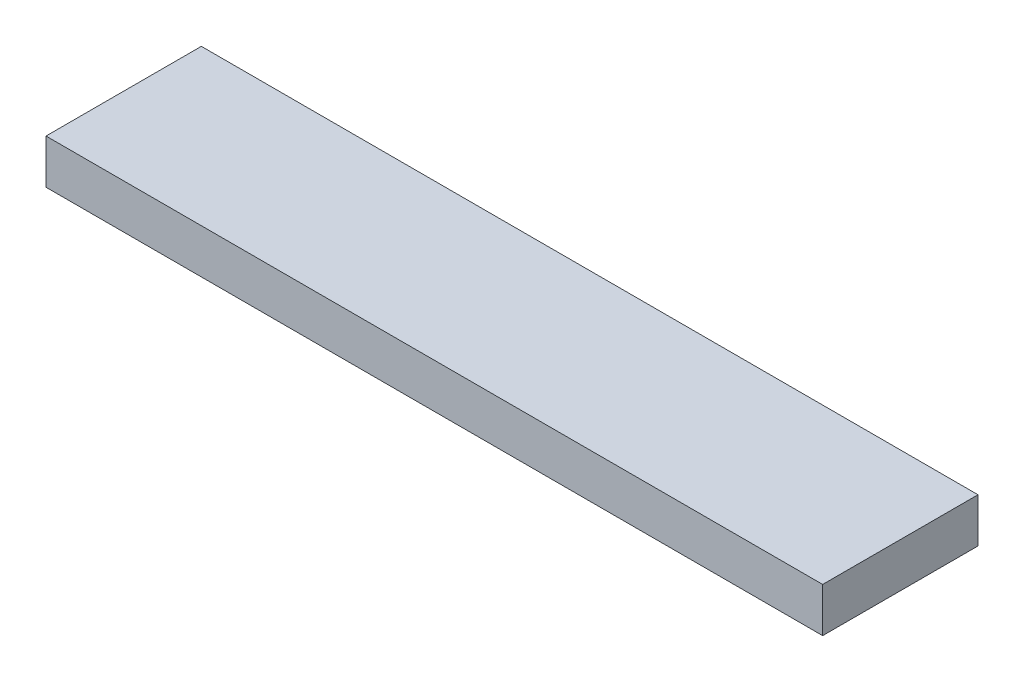
ISO-10303-21;
HEADER;
FILE_DESCRIPTION(('STEP AP214'),'2;1');
FILE_NAME('part.step','',(''),(''),'','','');
FILE_SCHEMA(('AUTOMOTIVE_DESIGN { 1 0 10303 214 1 1 1 1 }'));
ENDSEC;
DATA;
#1=APPLICATION_CONTEXT('core data for automotive mechanical design processes');
#2=APPLICATION_PROTOCOL_DEFINITION('international standard','automotive_design',2000,#1);
#3=PRODUCT_CONTEXT('',#1,'mechanical');
#4=PRODUCT('Part','Part','',(#3));
#5=PRODUCT_RELATED_PRODUCT_CATEGORY('part','',(#4));
#6=PRODUCT_DEFINITION_FORMATION('','',#4);
#7=PRODUCT_DEFINITION_CONTEXT('part definition',#1,'design');
#8=PRODUCT_DEFINITION('design','',#6,#7);
#9=PRODUCT_DEFINITION_SHAPE('','',#8);
#10=(LENGTH_UNIT() NAMED_UNIT(*) SI_UNIT(.MILLI.,.METRE.));
#11=(NAMED_UNIT(*) PLANE_ANGLE_UNIT() SI_UNIT($,.RADIAN.));
#12=(NAMED_UNIT(*) SI_UNIT($,.STERADIAN.) SOLID_ANGLE_UNIT());
#13=UNCERTAINTY_MEASURE_WITH_UNIT(LENGTH_MEASURE(1.E-05),#10,'distance_accuracy_value','');
#14=(GEOMETRIC_REPRESENTATION_CONTEXT(3) GLOBAL_UNCERTAINTY_ASSIGNED_CONTEXT((#13)) GLOBAL_UNIT_ASSIGNED_CONTEXT((#10,
#11,#12)) REPRESENTATION_CONTEXT('',''));
#15=CARTESIAN_POINT('',(0.,0.,0.));
#16=DIRECTION('',(0.,0.,1.));
#17=DIRECTION('',(1.,0.,0.));
#18=AXIS2_PLACEMENT_3D('',#15,#16,#17);
#19=CARTESIAN_POINT('',(-17.5,2.,3.5));
#20=DIRECTION('',(1.,0.,0.));
#21=DIRECTION('',(0.,0.,-1.));
#22=AXIS2_PLACEMENT_3D('',#19,#20,#21);
#23=PLANE('',#22);
#24=DIRECTION('',(0.,0.,1.));
#25=VECTOR('',#24,1.);
#26=CARTESIAN_POINT('',(-17.5,0.,3.5));
#27=LINE('',#26,#25);
#28=CARTESIAN_POINT('',(-17.5,0.,-3.5));
#29=VERTEX_POINT('',#28);
#30=CARTESIAN_POINT('',(-17.5,0.,3.5));
#31=VERTEX_POINT('',#30);
#32=EDGE_CURVE('E111',#29,#31,#27,.T.);
#33=ORIENTED_EDGE('',*,*,#32,.T.);
#34=DIRECTION('',(0.,-1.,0.));
#35=VECTOR('',#34,1.);
#36=CARTESIAN_POINT('',(-17.5,2.,3.5));
#37=LINE('',#36,#35);
#38=CARTESIAN_POINT('',(-17.5,2.,3.5));
#39=VERTEX_POINT('',#38);
#40=EDGE_CURVE('E11',#39,#31,#37,.T.);
#41=ORIENTED_EDGE('',*,*,#40,.F.);
#42=DIRECTION('',(0.,0.,1.));
#43=VECTOR('',#42,1.);
#44=CARTESIAN_POINT('',(-17.5,2.,3.5));
#45=LINE('',#44,#43);
#46=CARTESIAN_POINT('',(-17.5,2.,-3.5));
#47=VERTEX_POINT('',#46);
#48=EDGE_CURVE('E95',#47,#39,#45,.T.);
#49=ORIENTED_EDGE('',*,*,#48,.F.);
#50=DIRECTION('',(0.,-1.,0.));
#51=VECTOR('',#50,1.);
#52=CARTESIAN_POINT('',(-17.5,2.,-3.5));
#53=LINE('',#52,#51);
#54=EDGE_CURVE('E107',#47,#29,#53,.T.);
#55=ORIENTED_EDGE('',*,*,#54,.T.);
#56=EDGE_LOOP('',(#33,#41,#49,#55));
#57=FACE_BOUND('',#56,.T.);
#58=ADVANCED_FACE('F43',(#57),#23,.F.);
#59=CARTESIAN_POINT('',(17.5,2.,3.5));
#60=DIRECTION('',(0.,0.,-1.));
#61=DIRECTION('',(-1.,0.,0.));
#62=AXIS2_PLACEMENT_3D('',#59,#60,#61);
#63=PLANE('',#62);
#64=DIRECTION('',(1.,0.,0.));
#65=VECTOR('',#64,1.);
#66=CARTESIAN_POINT('',(17.5,0.,3.5));
#67=LINE('',#66,#65);
#68=CARTESIAN_POINT('',(17.5,0.,3.5));
#69=VERTEX_POINT('',#68);
#70=EDGE_CURVE('E100',#31,#69,#67,.T.);
#71=ORIENTED_EDGE('',*,*,#70,.T.);
#72=DIRECTION('',(0.,-1.,0.));
#73=VECTOR('',#72,1.);
#74=CARTESIAN_POINT('',(17.5,2.,3.5));
#75=LINE('',#74,#73);
#76=CARTESIAN_POINT('',(17.5,2.,3.5));
#77=VERTEX_POINT('',#76);
#78=EDGE_CURVE('E52',#77,#69,#75,.T.);
#79=ORIENTED_EDGE('',*,*,#78,.F.);
#80=DIRECTION('',(1.,0.,0.));
#81=VECTOR('',#80,1.);
#82=CARTESIAN_POINT('',(17.5,2.,3.5));
#83=LINE('',#82,#81);
#84=EDGE_CURVE('E90',#39,#77,#83,.T.);
#85=ORIENTED_EDGE('',*,*,#84,.F.);
#86=ORIENTED_EDGE('',*,*,#40,.T.);
#87=EDGE_LOOP('',(#71,#79,#85,#86));
#88=FACE_BOUND('',#87,.T.);
#89=ADVANCED_FACE('F99',(#88),#63,.F.);
#90=CARTESIAN_POINT('',(17.5,2.,3.5));
#91=DIRECTION('',(-1.,0.,0.));
#92=DIRECTION('',(0.,0.,1.));
#93=AXIS2_PLACEMENT_3D('',#90,#91,#92);
#94=PLANE('',#93);
#95=DIRECTION('',(0.,0.,-1.));
#96=VECTOR('',#95,1.);
#97=CARTESIAN_POINT('',(17.5,0.,3.5));
#98=LINE('',#97,#96);
#99=CARTESIAN_POINT('',(17.5,0.,-3.5));
#100=VERTEX_POINT('',#99);
#101=EDGE_CURVE('E77',#69,#100,#98,.T.);
#102=ORIENTED_EDGE('',*,*,#101,.T.);
#103=DIRECTION('',(0.,-1.,0.));
#104=VECTOR('',#103,1.);
#105=CARTESIAN_POINT('',(17.5,2.,-3.5));
#106=LINE('',#105,#104);
#107=CARTESIAN_POINT('',(17.5,2.,-3.5));
#108=VERTEX_POINT('',#107);
#109=EDGE_CURVE('E102',#108,#100,#106,.T.);
#110=ORIENTED_EDGE('',*,*,#109,.F.);
#111=DIRECTION('',(0.,0.,-1.));
#112=VECTOR('',#111,1.);
#113=CARTESIAN_POINT('',(17.5,2.,3.5));
#114=LINE('',#113,#112);
#115=EDGE_CURVE('E93',#77,#108,#114,.T.);
#116=ORIENTED_EDGE('',*,*,#115,.F.);
#117=ORIENTED_EDGE('',*,*,#78,.T.);
#118=EDGE_LOOP('',(#102,#110,#116,#117));
#119=FACE_BOUND('',#118,.T.);
#120=ADVANCED_FACE('F103',(#119),#94,.F.);
#121=CARTESIAN_POINT('',(17.5,2.,-3.5));
#122=DIRECTION('',(0.,0.,1.));
#123=DIRECTION('',(1.,0.,0.));
#124=AXIS2_PLACEMENT_3D('',#121,#122,#123);
#125=PLANE('',#124);
#126=DIRECTION('',(-1.,0.,0.));
#127=VECTOR('',#126,1.);
#128=CARTESIAN_POINT('',(17.5,0.,-3.5));
#129=LINE('',#128,#127);
#130=EDGE_CURVE('E83',#100,#29,#129,.T.);
#131=ORIENTED_EDGE('',*,*,#130,.T.);
#132=ORIENTED_EDGE('',*,*,#54,.F.);
#133=DIRECTION('',(-1.,0.,0.));
#134=VECTOR('',#133,1.);
#135=CARTESIAN_POINT('',(17.5,2.,-3.5));
#136=LINE('',#135,#134);
#137=EDGE_CURVE('E60',#108,#47,#136,.T.);
#138=ORIENTED_EDGE('',*,*,#137,.F.);
#139=ORIENTED_EDGE('',*,*,#109,.T.);
#140=EDGE_LOOP('',(#131,#132,#138,#139));
#141=FACE_BOUND('',#140,.T.);
#142=ADVANCED_FACE('F124',(#141),#125,.F.);
#143=CARTESIAN_POINT('',(0.,2.,0.));
#144=DIRECTION('',(0.,1.,0.));
#145=DIRECTION('',(0.,0.,1.));
#146=AXIS2_PLACEMENT_3D('',#143,#144,#145);
#147=PLANE('',#146);
#148=ORIENTED_EDGE('',*,*,#48,.T.);
#149=ORIENTED_EDGE('',*,*,#84,.T.);
#150=ORIENTED_EDGE('',*,*,#115,.T.);
#151=ORIENTED_EDGE('',*,*,#137,.T.);
#152=EDGE_LOOP('',(#148,#149,#150,#151));
#153=FACE_BOUND('',#152,.T.);
#154=ADVANCED_FACE('F91',(#153),#147,.T.);
#155=CARTESIAN_POINT('',(0.,0.,0.));
#156=DIRECTION('',(0.,1.,0.));
#157=DIRECTION('',(0.,0.,1.));
#158=AXIS2_PLACEMENT_3D('',#155,#156,#157);
#159=PLANE('',#158);
#160=ORIENTED_EDGE('',*,*,#32,.F.);
#161=ORIENTED_EDGE('',*,*,#130,.F.);
#162=ORIENTED_EDGE('',*,*,#101,.F.);
#163=ORIENTED_EDGE('',*,*,#70,.F.);
#164=EDGE_LOOP('',(#160,#161,#162,#163));
#165=FACE_BOUND('',#164,.T.);
#166=ADVANCED_FACE('F127',(#165),#159,.F.);
#167=CLOSED_SHELL('',(#58,#89,#120,#142,#154,#166));
#168=MANIFOLD_SOLID_BREP('B2',#167);
#169=ADVANCED_BREP_SHAPE_REPRESENTATION('',(#18,#168),#14);
#170=SHAPE_DEFINITION_REPRESENTATION(#9,#169);
ENDSEC;
END-ISO-10303-21;
